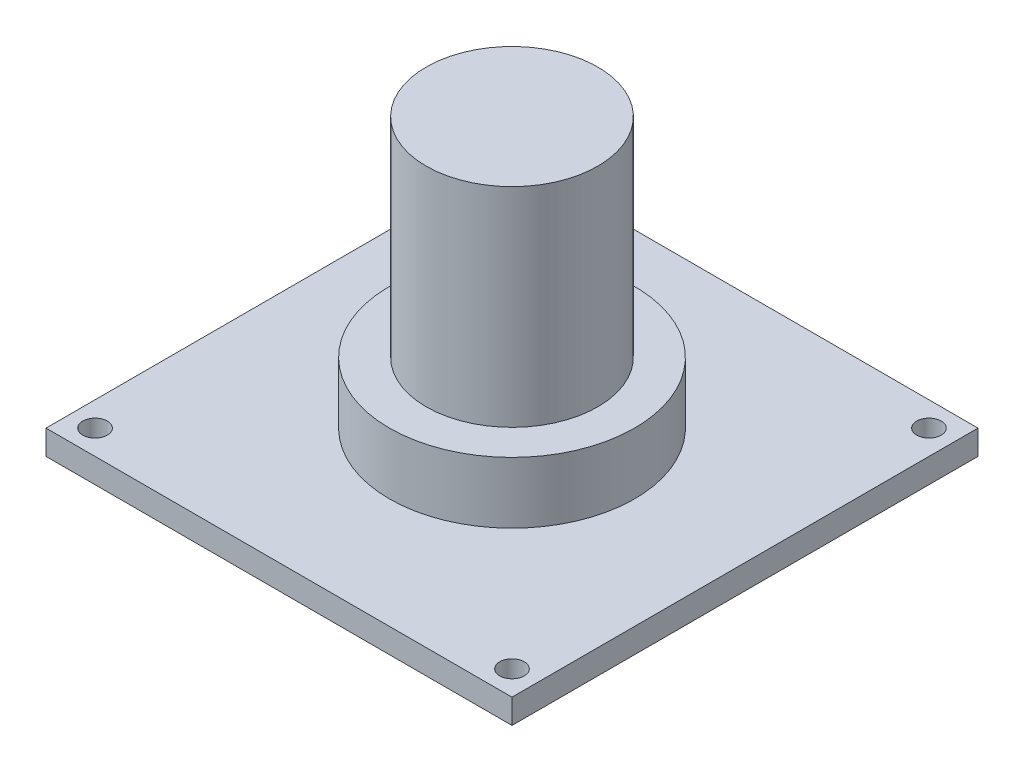
ISO-10303-21;
HEADER;
FILE_DESCRIPTION(('STEP AP214'),'2;1');
FILE_NAME('part.step','',(''),(''),'','','');
FILE_SCHEMA(('AUTOMOTIVE_DESIGN { 1 0 10303 214 1 1 1 1 }'));
ENDSEC;
DATA;
#1=APPLICATION_CONTEXT('core data for automotive mechanical design processes');
#2=APPLICATION_PROTOCOL_DEFINITION('international standard','automotive_design',2000,#1);
#3=PRODUCT_CONTEXT('',#1,'mechanical');
#4=PRODUCT('Part','Part','',(#3));
#5=PRODUCT_RELATED_PRODUCT_CATEGORY('part','',(#4));
#6=PRODUCT_DEFINITION_FORMATION('','',#4);
#7=PRODUCT_DEFINITION_CONTEXT('part definition',#1,'design');
#8=PRODUCT_DEFINITION('design','',#6,#7);
#9=PRODUCT_DEFINITION_SHAPE('','',#8);
#10=(LENGTH_UNIT() NAMED_UNIT(*) SI_UNIT(.MILLI.,.METRE.));
#11=(NAMED_UNIT(*) PLANE_ANGLE_UNIT() SI_UNIT($,.RADIAN.));
#12=(NAMED_UNIT(*) SI_UNIT($,.STERADIAN.) SOLID_ANGLE_UNIT());
#13=UNCERTAINTY_MEASURE_WITH_UNIT(LENGTH_MEASURE(1.E-05),#10,'distance_accuracy_value','');
#14=(GEOMETRIC_REPRESENTATION_CONTEXT(3) GLOBAL_UNCERTAINTY_ASSIGNED_CONTEXT((#13)) GLOBAL_UNIT_ASSIGNED_CONTEXT((#10,
#11,#12)) REPRESENTATION_CONTEXT('',''));
#15=CARTESIAN_POINT('',(0.,0.,0.));
#16=DIRECTION('',(0.,0.,1.));
#17=DIRECTION('',(1.,0.,0.));
#18=AXIS2_PLACEMENT_3D('',#15,#16,#17);
#19=CARTESIAN_POINT('',(0.,2.,0.));
#20=DIRECTION('',(0.,-1.,0.));
#21=DIRECTION('',(0.,0.,-1.));
#22=AXIS2_PLACEMENT_3D('',#19,#20,#21);
#23=PLANE('',#22);
#24=CARTESIAN_POINT('',(0.,2.,0.));
#25=DIRECTION('',(0.,1.,0.));
#26=DIRECTION('',(0.,0.,1.));
#27=AXIS2_PLACEMENT_3D('',#24,#25,#26);
#28=CIRCLE('',#27,10.);
#29=CARTESIAN_POINT('',(0.,2.,10.));
#30=VERTEX_POINT('',#29);
#31=EDGE_CURVE('E50',#30,#30,#28,.T.);
#32=ORIENTED_EDGE('',*,*,#31,.F.);
#33=EDGE_LOOP('',(#32));
#34=FACE_BOUND('',#33,.T.);
#35=DIRECTION('',(0.,0.,-1.));
#36=VECTOR('',#35,1.);
#37=CARTESIAN_POINT('',(19.,2.,19.));
#38=LINE('',#37,#36);
#39=CARTESIAN_POINT('',(19.,2.,19.));
#40=VERTEX_POINT('',#39);
#41=CARTESIAN_POINT('',(19.,2.,-19.));
#42=VERTEX_POINT('',#41);
#43=EDGE_CURVE('E95',#40,#42,#38,.T.);
#44=ORIENTED_EDGE('',*,*,#43,.T.);
#45=DIRECTION('',(-1.,0.,0.));
#46=VECTOR('',#45,1.);
#47=CARTESIAN_POINT('',(-19.,2.,-19.));
#48=LINE('',#47,#46);
#49=CARTESIAN_POINT('',(-19.,2.,-19.));
#50=VERTEX_POINT('',#49);
#51=EDGE_CURVE('E90',#42,#50,#48,.T.);
#52=ORIENTED_EDGE('',*,*,#51,.T.);
#53=DIRECTION('',(0.,0.,1.));
#54=VECTOR('',#53,1.);
#55=CARTESIAN_POINT('',(-19.,2.,19.));
#56=LINE('',#55,#54);
#57=CARTESIAN_POINT('',(-19.,2.,19.));
#58=VERTEX_POINT('',#57);
#59=EDGE_CURVE('E93',#50,#58,#56,.T.);
#60=ORIENTED_EDGE('',*,*,#59,.T.);
#61=DIRECTION('',(1.,0.,0.));
#62=VECTOR('',#61,1.);
#63=CARTESIAN_POINT('',(-19.,2.,19.));
#64=LINE('',#63,#62);
#65=EDGE_CURVE('E59',#58,#40,#64,.T.);
#66=ORIENTED_EDGE('',*,*,#65,.T.);
#67=EDGE_LOOP('',(#44,#52,#60,#66));
#68=FACE_BOUND('',#67,.T.);
#69=CARTESIAN_POINT('',(-17.,2.,-17.));
#70=DIRECTION('',(0.,1.,0.));
#71=DIRECTION('',(0.,0.,1.));
#72=AXIS2_PLACEMENT_3D('',#69,#70,#71);
#73=CIRCLE('',#72,1.);
#74=CARTESIAN_POINT('',(-17.,2.,-16.));
#75=VERTEX_POINT('',#74);
#76=EDGE_CURVE('E116',#75,#75,#73,.T.);
#77=ORIENTED_EDGE('',*,*,#76,.F.);
#78=EDGE_LOOP('',(#77));
#79=FACE_BOUND('',#78,.T.);
#80=CARTESIAN_POINT('',(17.,2.,-17.));
#81=DIRECTION('',(0.,1.,0.));
#82=DIRECTION('',(0.,0.,1.));
#83=AXIS2_PLACEMENT_3D('',#80,#81,#82);
#84=CIRCLE('',#83,1.);
#85=CARTESIAN_POINT('',(17.,2.,-16.));
#86=VERTEX_POINT('',#85);
#87=EDGE_CURVE('E138',#86,#86,#84,.T.);
#88=ORIENTED_EDGE('',*,*,#87,.F.);
#89=EDGE_LOOP('',(#88));
#90=FACE_BOUND('',#89,.T.);
#91=CARTESIAN_POINT('',(17.,2.,17.));
#92=DIRECTION('',(0.,1.,0.));
#93=DIRECTION('',(0.,0.,1.));
#94=AXIS2_PLACEMENT_3D('',#91,#92,#93);
#95=CIRCLE('',#94,1.);
#96=CARTESIAN_POINT('',(17.,2.,18.));
#97=VERTEX_POINT('',#96);
#98=EDGE_CURVE('E146',#97,#97,#95,.T.);
#99=ORIENTED_EDGE('',*,*,#98,.F.);
#100=EDGE_LOOP('',(#99));
#101=FACE_BOUND('',#100,.T.);
#102=CARTESIAN_POINT('',(-17.,2.,17.));
#103=DIRECTION('',(0.,1.,0.));
#104=DIRECTION('',(0.,0.,1.));
#105=AXIS2_PLACEMENT_3D('',#102,#103,#104);
#106=CIRCLE('',#105,1.);
#107=CARTESIAN_POINT('',(-17.,2.,18.));
#108=VERTEX_POINT('',#107);
#109=EDGE_CURVE('E154',#108,#108,#106,.T.);
#110=ORIENTED_EDGE('',*,*,#109,.F.);
#111=EDGE_LOOP('',(#110));
#112=FACE_BOUND('',#111,.T.);
#113=ADVANCED_FACE('F39',(#34,#68,#79,#90,#101,#112),#23,.F.);
#114=CARTESIAN_POINT('',(0.,0.,0.));
#115=DIRECTION('',(0.,-1.,0.));
#116=DIRECTION('',(0.,0.,-1.));
#117=AXIS2_PLACEMENT_3D('',#114,#115,#116);
#118=PLANE('',#117);
#119=CARTESIAN_POINT('',(17.,0.,17.));
#120=DIRECTION('',(0.,1.,0.));
#121=DIRECTION('',(0.,0.,1.));
#122=AXIS2_PLACEMENT_3D('',#119,#120,#121);
#123=CIRCLE('',#122,1.);
#124=CARTESIAN_POINT('',(17.,0.,18.));
#125=VERTEX_POINT('',#124);
#126=EDGE_CURVE('E150',#125,#125,#123,.T.);
#127=ORIENTED_EDGE('',*,*,#126,.T.);
#128=EDGE_LOOP('',(#127));
#129=FACE_BOUND('',#128,.T.);
#130=CARTESIAN_POINT('',(-17.,0.,-17.));
#131=DIRECTION('',(0.,1.,0.));
#132=DIRECTION('',(0.,0.,1.));
#133=AXIS2_PLACEMENT_3D('',#130,#131,#132);
#134=CIRCLE('',#133,1.);
#135=CARTESIAN_POINT('',(-17.,0.,-16.));
#136=VERTEX_POINT('',#135);
#137=EDGE_CURVE('E134',#136,#136,#134,.T.);
#138=ORIENTED_EDGE('',*,*,#137,.T.);
#139=EDGE_LOOP('',(#138));
#140=FACE_BOUND('',#139,.T.);
#141=DIRECTION('',(0.,0.,-1.));
#142=VECTOR('',#141,1.);
#143=CARTESIAN_POINT('',(19.,0.,19.));
#144=LINE('',#143,#142);
#145=CARTESIAN_POINT('',(19.,0.,19.));
#146=VERTEX_POINT('',#145);
#147=CARTESIAN_POINT('',(19.,0.,-19.));
#148=VERTEX_POINT('',#147);
#149=EDGE_CURVE('E112',#146,#148,#144,.T.);
#150=ORIENTED_EDGE('',*,*,#149,.F.);
#151=DIRECTION('',(1.,0.,0.));
#152=VECTOR('',#151,1.);
#153=CARTESIAN_POINT('',(-19.,0.,19.));
#154=LINE('',#153,#152);
#155=CARTESIAN_POINT('',(-19.,0.,19.));
#156=VERTEX_POINT('',#155);
#157=EDGE_CURVE('E82',#156,#146,#154,.T.);
#158=ORIENTED_EDGE('',*,*,#157,.F.);
#159=DIRECTION('',(0.,0.,1.));
#160=VECTOR('',#159,1.);
#161=CARTESIAN_POINT('',(-19.,0.,19.));
#162=LINE('',#161,#160);
#163=CARTESIAN_POINT('',(-19.,0.,-19.));
#164=VERTEX_POINT('',#163);
#165=EDGE_CURVE('E76',#164,#156,#162,.T.);
#166=ORIENTED_EDGE('',*,*,#165,.F.);
#167=DIRECTION('',(-1.,0.,0.));
#168=VECTOR('',#167,1.);
#169=CARTESIAN_POINT('',(-19.,0.,-19.));
#170=LINE('',#169,#168);
#171=EDGE_CURVE('E101',#148,#164,#170,.T.);
#172=ORIENTED_EDGE('',*,*,#171,.F.);
#173=EDGE_LOOP('',(#150,#158,#166,#172));
#174=FACE_BOUND('',#173,.T.);
#175=CARTESIAN_POINT('',(17.,0.,-17.));
#176=DIRECTION('',(0.,1.,0.));
#177=DIRECTION('',(0.,0.,1.));
#178=AXIS2_PLACEMENT_3D('',#175,#176,#177);
#179=CIRCLE('',#178,1.);
#180=CARTESIAN_POINT('',(17.,0.,-16.));
#181=VERTEX_POINT('',#180);
#182=EDGE_CURVE('E142',#181,#181,#179,.T.);
#183=ORIENTED_EDGE('',*,*,#182,.T.);
#184=EDGE_LOOP('',(#183));
#185=FACE_BOUND('',#184,.T.);
#186=CARTESIAN_POINT('',(-17.,0.,17.));
#187=DIRECTION('',(0.,1.,0.));
#188=DIRECTION('',(0.,0.,1.));
#189=AXIS2_PLACEMENT_3D('',#186,#187,#188);
#190=CIRCLE('',#189,1.);
#191=CARTESIAN_POINT('',(-17.,0.,18.));
#192=VERTEX_POINT('',#191);
#193=EDGE_CURVE('E158',#192,#192,#190,.T.);
#194=ORIENTED_EDGE('',*,*,#193,.T.);
#195=EDGE_LOOP('',(#194));
#196=FACE_BOUND('',#195,.T.);
#197=ADVANCED_FACE('F129',(#129,#140,#174,#185,#196),#118,.T.);
#198=CARTESIAN_POINT('',(19.,2.,19.));
#199=DIRECTION('',(-1.,0.,0.));
#200=DIRECTION('',(0.,0.,1.));
#201=AXIS2_PLACEMENT_3D('',#198,#199,#200);
#202=PLANE('',#201);
#203=ORIENTED_EDGE('',*,*,#149,.T.);
#204=DIRECTION('',(0.,-1.,0.));
#205=VECTOR('',#204,1.);
#206=CARTESIAN_POINT('',(19.,2.,-19.));
#207=LINE('',#206,#205);
#208=EDGE_CURVE('E43',#42,#148,#207,.T.);
#209=ORIENTED_EDGE('',*,*,#208,.F.);
#210=ORIENTED_EDGE('',*,*,#43,.F.);
#211=DIRECTION('',(0.,-1.,0.));
#212=VECTOR('',#211,1.);
#213=CARTESIAN_POINT('',(19.,2.,19.));
#214=LINE('',#213,#212);
#215=EDGE_CURVE('E108',#40,#146,#214,.T.);
#216=ORIENTED_EDGE('',*,*,#215,.T.);
#217=EDGE_LOOP('',(#203,#209,#210,#216));
#218=FACE_BOUND('',#217,.T.);
#219=ADVANCED_FACE('F41',(#218),#202,.F.);
#220=CARTESIAN_POINT('',(-19.,2.,-19.));
#221=DIRECTION('',(0.,0.,1.));
#222=DIRECTION('',(1.,0.,0.));
#223=AXIS2_PLACEMENT_3D('',#220,#221,#222);
#224=PLANE('',#223);
#225=ORIENTED_EDGE('',*,*,#171,.T.);
#226=DIRECTION('',(0.,-1.,0.));
#227=VECTOR('',#226,1.);
#228=CARTESIAN_POINT('',(-19.,2.,-19.));
#229=LINE('',#228,#227);
#230=EDGE_CURVE('E99',#50,#164,#229,.T.);
#231=ORIENTED_EDGE('',*,*,#230,.F.);
#232=ORIENTED_EDGE('',*,*,#51,.F.);
#233=ORIENTED_EDGE('',*,*,#208,.T.);
#234=EDGE_LOOP('',(#225,#231,#232,#233));
#235=FACE_BOUND('',#234,.T.);
#236=ADVANCED_FACE('F100',(#235),#224,.F.);
#237=CARTESIAN_POINT('',(-19.,2.,19.));
#238=DIRECTION('',(1.,0.,0.));
#239=DIRECTION('',(0.,0.,-1.));
#240=AXIS2_PLACEMENT_3D('',#237,#238,#239);
#241=PLANE('',#240);
#242=ORIENTED_EDGE('',*,*,#165,.T.);
#243=DIRECTION('',(0.,-1.,0.));
#244=VECTOR('',#243,1.);
#245=CARTESIAN_POINT('',(-19.,2.,19.));
#246=LINE('',#245,#244);
#247=EDGE_CURVE('E103',#58,#156,#246,.T.);
#248=ORIENTED_EDGE('',*,*,#247,.F.);
#249=ORIENTED_EDGE('',*,*,#59,.F.);
#250=ORIENTED_EDGE('',*,*,#230,.T.);
#251=EDGE_LOOP('',(#242,#248,#249,#250));
#252=FACE_BOUND('',#251,.T.);
#253=ADVANCED_FACE('F104',(#252),#241,.F.);
#254=CARTESIAN_POINT('',(-19.,2.,19.));
#255=DIRECTION('',(0.,0.,-1.));
#256=DIRECTION('',(-1.,0.,0.));
#257=AXIS2_PLACEMENT_3D('',#254,#255,#256);
#258=PLANE('',#257);
#259=ORIENTED_EDGE('',*,*,#157,.T.);
#260=ORIENTED_EDGE('',*,*,#215,.F.);
#261=ORIENTED_EDGE('',*,*,#65,.F.);
#262=ORIENTED_EDGE('',*,*,#247,.T.);
#263=EDGE_LOOP('',(#259,#260,#261,#262));
#264=FACE_BOUND('',#263,.T.);
#265=ADVANCED_FACE('F126',(#264),#258,.F.);
#266=CARTESIAN_POINT('',(-17.,2.,-17.));
#267=DIRECTION('',(0.,-1.,0.));
#268=DIRECTION('',(0.,0.,-1.));
#269=AXIS2_PLACEMENT_3D('',#266,#267,#268);
#270=CYLINDRICAL_SURFACE('',#269,1.);
#271=ORIENTED_EDGE('',*,*,#76,.T.);
#272=EDGE_LOOP('',(#271));
#273=FACE_BOUND('',#272,.T.);
#274=ORIENTED_EDGE('',*,*,#137,.F.);
#275=EDGE_LOOP('',(#274));
#276=FACE_BOUND('',#275,.T.);
#277=ADVANCED_FACE('F206',(#273,#276),#270,.F.);
#278=CARTESIAN_POINT('',(17.,2.,-17.));
#279=DIRECTION('',(0.,-1.,0.));
#280=DIRECTION('',(0.,0.,-1.));
#281=AXIS2_PLACEMENT_3D('',#278,#279,#280);
#282=CYLINDRICAL_SURFACE('',#281,1.);
#283=ORIENTED_EDGE('',*,*,#87,.T.);
#284=EDGE_LOOP('',(#283));
#285=FACE_BOUND('',#284,.T.);
#286=ORIENTED_EDGE('',*,*,#182,.F.);
#287=EDGE_LOOP('',(#286));
#288=FACE_BOUND('',#287,.T.);
#289=ADVANCED_FACE('F251',(#285,#288),#282,.F.);
#290=CARTESIAN_POINT('',(17.,2.,17.));
#291=DIRECTION('',(0.,-1.,0.));
#292=DIRECTION('',(0.,0.,-1.));
#293=AXIS2_PLACEMENT_3D('',#290,#291,#292);
#294=CYLINDRICAL_SURFACE('',#293,1.);
#295=ORIENTED_EDGE('',*,*,#98,.T.);
#296=EDGE_LOOP('',(#295));
#297=FACE_BOUND('',#296,.T.);
#298=ORIENTED_EDGE('',*,*,#126,.F.);
#299=EDGE_LOOP('',(#298));
#300=FACE_BOUND('',#299,.T.);
#301=ADVANCED_FACE('F259',(#297,#300),#294,.F.);
#302=CARTESIAN_POINT('',(-17.,2.,17.));
#303=DIRECTION('',(0.,-1.,0.));
#304=DIRECTION('',(0.,0.,-1.));
#305=AXIS2_PLACEMENT_3D('',#302,#303,#304);
#306=CYLINDRICAL_SURFACE('',#305,1.);
#307=ORIENTED_EDGE('',*,*,#109,.T.);
#308=EDGE_LOOP('',(#307));
#309=FACE_BOUND('',#308,.T.);
#310=ORIENTED_EDGE('',*,*,#193,.F.);
#311=EDGE_LOOP('',(#310));
#312=FACE_BOUND('',#311,.T.);
#313=ADVANCED_FACE('F194',(#309,#312),#306,.F.);
#314=CARTESIAN_POINT('',(0.,7.,0.));
#315=DIRECTION('',(0.,-1.,0.));
#316=DIRECTION('',(0.,0.,-1.));
#317=AXIS2_PLACEMENT_3D('',#314,#315,#316);
#318=CYLINDRICAL_SURFACE('',#317,10.);
#319=CARTESIAN_POINT('',(0.,7.,0.));
#320=DIRECTION('',(0.,1.,0.));
#321=DIRECTION('',(0.,0.,1.));
#322=AXIS2_PLACEMENT_3D('',#319,#320,#321);
#323=CIRCLE('',#322,10.);
#324=CARTESIAN_POINT('',(0.,7.,10.));
#325=VERTEX_POINT('',#324);
#326=EDGE_CURVE('E162',#325,#325,#323,.T.);
#327=ORIENTED_EDGE('',*,*,#326,.F.);
#328=EDGE_LOOP('',(#327));
#329=FACE_BOUND('',#328,.T.);
#330=ORIENTED_EDGE('',*,*,#31,.T.);
#331=EDGE_LOOP('',(#330));
#332=FACE_BOUND('',#331,.T.);
#333=ADVANCED_FACE('F188',(#329,#332),#318,.T.);
#334=CARTESIAN_POINT('',(0.,7.,0.));
#335=DIRECTION('',(0.,1.,0.));
#336=DIRECTION('',(0.,0.,1.));
#337=AXIS2_PLACEMENT_3D('',#334,#335,#336);
#338=PLANE('',#337);
#339=CARTESIAN_POINT('',(0.,7.,0.));
#340=DIRECTION('',(0.,1.,0.));
#341=DIRECTION('',(0.,0.,1.));
#342=AXIS2_PLACEMENT_3D('',#339,#340,#341);
#343=CIRCLE('',#342,7.);
#344=CARTESIAN_POINT('',(0.,7.,7.));
#345=VERTEX_POINT('',#344);
#346=EDGE_CURVE('E11',#345,#345,#343,.T.);
#347=ORIENTED_EDGE('',*,*,#346,.F.);
#348=EDGE_LOOP('',(#347));
#349=FACE_BOUND('',#348,.T.);
#350=ORIENTED_EDGE('',*,*,#326,.T.);
#351=EDGE_LOOP('',(#350));
#352=FACE_BOUND('',#351,.T.);
#353=ADVANCED_FACE('F182',(#349,#352),#338,.T.);
#354=CARTESIAN_POINT('',(0.,24.,0.));
#355=DIRECTION('',(0.,-1.,0.));
#356=DIRECTION('',(0.,0.,-1.));
#357=AXIS2_PLACEMENT_3D('',#354,#355,#356);
#358=CYLINDRICAL_SURFACE('',#357,7.);
#359=CARTESIAN_POINT('',(0.,24.,0.));
#360=DIRECTION('',(0.,1.,0.));
#361=DIRECTION('',(0.,0.,1.));
#362=AXIS2_PLACEMENT_3D('',#359,#360,#361);
#363=CIRCLE('',#362,7.);
#364=CARTESIAN_POINT('',(0.,24.,7.));
#365=VERTEX_POINT('',#364);
#366=EDGE_CURVE('E171',#365,#365,#363,.T.);
#367=ORIENTED_EDGE('',*,*,#366,.F.);
#368=EDGE_LOOP('',(#367));
#369=FACE_BOUND('',#368,.T.);
#370=ORIENTED_EDGE('',*,*,#346,.T.);
#371=EDGE_LOOP('',(#370));
#372=FACE_BOUND('',#371,.T.);
#373=ADVANCED_FACE('F179',(#369,#372),#358,.T.);
#374=CARTESIAN_POINT('',(0.,24.,0.));
#375=DIRECTION('',(0.,1.,0.));
#376=DIRECTION('',(0.,0.,1.));
#377=AXIS2_PLACEMENT_3D('',#374,#375,#376);
#378=PLANE('',#377);
#379=ORIENTED_EDGE('',*,*,#366,.T.);
#380=EDGE_LOOP('',(#379));
#381=FACE_BOUND('',#380,.T.);
#382=ADVANCED_FACE('F177',(#381),#378,.T.);
#383=CLOSED_SHELL('',(#113,#197,#219,#236,#253,#265,#277,#289,#301,#313,#333,#353,#373,#382));
#384=MANIFOLD_SOLID_BREP('B2',#383);
#385=ADVANCED_BREP_SHAPE_REPRESENTATION('',(#18,#384),#14);
#386=SHAPE_DEFINITION_REPRESENTATION(#9,#385);
ENDSEC;
END-ISO-10303-21;
